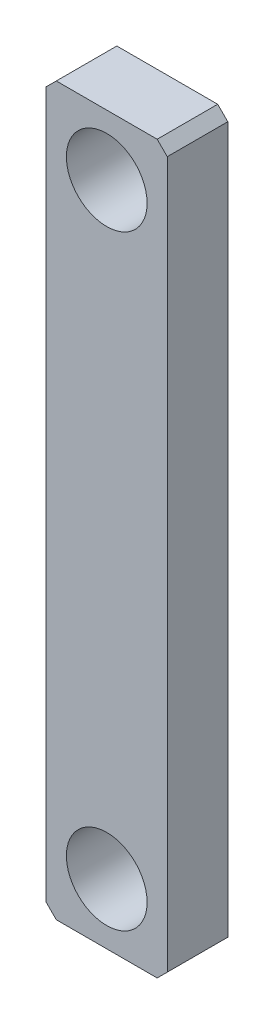
ISO-10303-21;
HEADER;
FILE_DESCRIPTION(('STEP AP214'),'2;1');
FILE_NAME('part.step','',(''),(''),'','','');
FILE_SCHEMA(('AUTOMOTIVE_DESIGN { 1 0 10303 214 1 1 1 1 }'));
ENDSEC;
DATA;
#1=APPLICATION_CONTEXT('core data for automotive mechanical design processes');
#2=APPLICATION_PROTOCOL_DEFINITION('international standard','automotive_design',2000,#1);
#3=PRODUCT_CONTEXT('',#1,'mechanical');
#4=PRODUCT('Part','Part','',(#3));
#5=PRODUCT_RELATED_PRODUCT_CATEGORY('part','',(#4));
#6=PRODUCT_DEFINITION_FORMATION('','',#4);
#7=PRODUCT_DEFINITION_CONTEXT('part definition',#1,'design');
#8=PRODUCT_DEFINITION('design','',#6,#7);
#9=PRODUCT_DEFINITION_SHAPE('','',#8);
#10=(LENGTH_UNIT() NAMED_UNIT(*) SI_UNIT(.MILLI.,.METRE.));
#11=(NAMED_UNIT(*) PLANE_ANGLE_UNIT() SI_UNIT($,.RADIAN.));
#12=(NAMED_UNIT(*) SI_UNIT($,.STERADIAN.) SOLID_ANGLE_UNIT());
#13=UNCERTAINTY_MEASURE_WITH_UNIT(LENGTH_MEASURE(1.E-05),#10,'distance_accuracy_value','');
#14=(GEOMETRIC_REPRESENTATION_CONTEXT(3) GLOBAL_UNCERTAINTY_ASSIGNED_CONTEXT((#13)) GLOBAL_UNIT_ASSIGNED_CONTEXT((#10,
#11,#12)) REPRESENTATION_CONTEXT('',''));
#15=CARTESIAN_POINT('',(0.,0.,0.));
#16=DIRECTION('',(0.,0.,1.));
#17=DIRECTION('',(1.,0.,0.));
#18=AXIS2_PLACEMENT_3D('',#15,#16,#17);
#19=CARTESIAN_POINT('',(0.,0.,6.));
#20=DIRECTION('',(1.,0.,0.));
#21=DIRECTION('',(0.,0.,-1.));
#22=AXIS2_PLACEMENT_3D('',#19,#20,#21);
#23=PLANE('',#22);
#24=DIRECTION('',(0.,-1.,0.));
#25=VECTOR('',#24,1.);
#26=CARTESIAN_POINT('',(0.,0.,0.));
#27=LINE('',#26,#25);
#28=CARTESIAN_POINT('',(0.,71.,0.));
#29=VERTEX_POINT('',#28);
#30=CARTESIAN_POINT('',(0.,1.00000000000001,0.));
#31=VERTEX_POINT('',#30);
#32=EDGE_CURVE('E137',#29,#31,#27,.T.);
#33=ORIENTED_EDGE('',*,*,#32,.T.);
#34=DIRECTION('',(0.,0.,1.));
#35=VECTOR('',#34,1.);
#36=CARTESIAN_POINT('',(0.,1.00000000000001,6.));
#37=LINE('',#36,#35);
#38=CARTESIAN_POINT('',(0.,1.00000000000001,6.));
#39=VERTEX_POINT('',#38);
#40=EDGE_CURVE('E115',#31,#39,#37,.T.);
#41=ORIENTED_EDGE('',*,*,#40,.T.);
#42=DIRECTION('',(0.,-1.,0.));
#43=VECTOR('',#42,1.);
#44=CARTESIAN_POINT('',(0.,0.,6.));
#45=LINE('',#44,#43);
#46=CARTESIAN_POINT('',(0.,71.,6.));
#47=VERTEX_POINT('',#46);
#48=EDGE_CURVE('E147',#47,#39,#45,.T.);
#49=ORIENTED_EDGE('',*,*,#48,.F.);
#50=DIRECTION('',(0.,0.,-1.));
#51=VECTOR('',#50,1.);
#52=CARTESIAN_POINT('',(0.,71.,6.));
#53=LINE('',#52,#51);
#54=EDGE_CURVE('E120',#47,#29,#53,.T.);
#55=ORIENTED_EDGE('',*,*,#54,.T.);
#56=EDGE_LOOP('',(#33,#41,#49,#55));
#57=FACE_BOUND('',#56,.T.);
#58=ADVANCED_FACE('F43',(#57),#23,.F.);
#59=CARTESIAN_POINT('',(0.,0.,6.));
#60=DIRECTION('',(0.,1.,0.));
#61=DIRECTION('',(0.,0.,1.));
#62=AXIS2_PLACEMENT_3D('',#59,#60,#61);
#63=PLANE('',#62);
#64=DIRECTION('',(1.,0.,0.));
#65=VECTOR('',#64,1.);
#66=CARTESIAN_POINT('',(0.,0.,6.));
#67=LINE('',#66,#65);
#68=CARTESIAN_POINT('',(1.,0.,6.));
#69=VERTEX_POINT('',#68);
#70=CARTESIAN_POINT('',(11.,0.,6.));
#71=VERTEX_POINT('',#70);
#72=EDGE_CURVE('E130',#69,#71,#67,.T.);
#73=ORIENTED_EDGE('',*,*,#72,.F.);
#74=DIRECTION('',(0.,0.,-1.));
#75=VECTOR('',#74,1.);
#76=CARTESIAN_POINT('',(1.,0.,6.));
#77=LINE('',#76,#75);
#78=CARTESIAN_POINT('',(1.,0.,0.));
#79=VERTEX_POINT('',#78);
#80=EDGE_CURVE('E114',#69,#79,#77,.T.);
#81=ORIENTED_EDGE('',*,*,#80,.T.);
#82=DIRECTION('',(1.,0.,0.));
#83=VECTOR('',#82,1.);
#84=CARTESIAN_POINT('',(0.,0.,0.));
#85=LINE('',#84,#83);
#86=CARTESIAN_POINT('',(11.,0.,0.));
#87=VERTEX_POINT('',#86);
#88=EDGE_CURVE('E127',#79,#87,#85,.T.);
#89=ORIENTED_EDGE('',*,*,#88,.T.);
#90=DIRECTION('',(0.,0.,1.));
#91=VECTOR('',#90,1.);
#92=CARTESIAN_POINT('',(11.,0.,6.));
#93=LINE('',#92,#91);
#94=EDGE_CURVE('E132',#87,#71,#93,.T.);
#95=ORIENTED_EDGE('',*,*,#94,.T.);
#96=EDGE_LOOP('',(#73,#81,#89,#95));
#97=FACE_BOUND('',#96,.T.);
#98=ADVANCED_FACE('F126',(#97),#63,.F.);
#99=CARTESIAN_POINT('',(12.,0.,6.));
#100=DIRECTION('',(-1.,0.,0.));
#101=DIRECTION('',(0.,-1.,0.));
#102=AXIS2_PLACEMENT_3D('',#99,#100,#101);
#103=PLANE('',#102);
#104=DIRECTION('',(0.,1.,0.));
#105=VECTOR('',#104,1.);
#106=CARTESIAN_POINT('',(12.,0.,6.));
#107=LINE('',#106,#105);
#108=CARTESIAN_POINT('',(12.,1.,6.));
#109=VERTEX_POINT('',#108);
#110=CARTESIAN_POINT('',(12.,71.,6.));
#111=VERTEX_POINT('',#110);
#112=EDGE_CURVE('E173',#109,#111,#107,.T.);
#113=ORIENTED_EDGE('',*,*,#112,.F.);
#114=DIRECTION('',(0.,0.,-1.));
#115=VECTOR('',#114,1.);
#116=CARTESIAN_POINT('',(12.,1.,6.));
#117=LINE('',#116,#115);
#118=CARTESIAN_POINT('',(12.,1.,0.));
#119=VERTEX_POINT('',#118);
#120=EDGE_CURVE('E166',#109,#119,#117,.T.);
#121=ORIENTED_EDGE('',*,*,#120,.T.);
#122=DIRECTION('',(0.,1.,0.));
#123=VECTOR('',#122,1.);
#124=CARTESIAN_POINT('',(12.,0.,0.));
#125=LINE('',#124,#123);
#126=CARTESIAN_POINT('',(12.,71.,0.));
#127=VERTEX_POINT('',#126);
#128=EDGE_CURVE('E136',#119,#127,#125,.T.);
#129=ORIENTED_EDGE('',*,*,#128,.T.);
#130=DIRECTION('',(0.,0.,1.));
#131=VECTOR('',#130,1.);
#132=CARTESIAN_POINT('',(12.,71.,6.));
#133=LINE('',#132,#131);
#134=EDGE_CURVE('E164',#127,#111,#133,.T.);
#135=ORIENTED_EDGE('',*,*,#134,.T.);
#136=EDGE_LOOP('',(#113,#121,#129,#135));
#137=FACE_BOUND('',#136,.T.);
#138=ADVANCED_FACE('F171',(#137),#103,.F.);
#139=CARTESIAN_POINT('',(0.,72.,6.));
#140=DIRECTION('',(0.,-1.,0.));
#141=DIRECTION('',(0.,0.,-1.));
#142=AXIS2_PLACEMENT_3D('',#139,#140,#141);
#143=PLANE('',#142);
#144=DIRECTION('',(-1.,0.,0.));
#145=VECTOR('',#144,1.);
#146=CARTESIAN_POINT('',(0.,72.,6.));
#147=LINE('',#146,#145);
#148=CARTESIAN_POINT('',(11.,72.,6.));
#149=VERTEX_POINT('',#148);
#150=CARTESIAN_POINT('',(0.999999999999994,72.,6.));
#151=VERTEX_POINT('',#150);
#152=EDGE_CURVE('E148',#149,#151,#147,.T.);
#153=ORIENTED_EDGE('',*,*,#152,.F.);
#154=DIRECTION('',(0.,0.,-1.));
#155=VECTOR('',#154,1.);
#156=CARTESIAN_POINT('',(11.,72.,6.));
#157=LINE('',#156,#155);
#158=CARTESIAN_POINT('',(11.,72.,0.));
#159=VERTEX_POINT('',#158);
#160=EDGE_CURVE('E11',#149,#159,#157,.T.);
#161=ORIENTED_EDGE('',*,*,#160,.T.);
#162=DIRECTION('',(-1.,0.,0.));
#163=VECTOR('',#162,1.);
#164=CARTESIAN_POINT('',(0.,72.,0.));
#165=LINE('',#164,#163);
#166=CARTESIAN_POINT('',(0.999999999999994,72.,0.));
#167=VERTEX_POINT('',#166);
#168=EDGE_CURVE('E140',#159,#167,#165,.T.);
#169=ORIENTED_EDGE('',*,*,#168,.T.);
#170=DIRECTION('',(0.,0.,1.));
#171=VECTOR('',#170,1.);
#172=CARTESIAN_POINT('',(0.999999999999994,72.,6.));
#173=LINE('',#172,#171);
#174=EDGE_CURVE('E52',#167,#151,#173,.T.);
#175=ORIENTED_EDGE('',*,*,#174,.T.);
#176=EDGE_LOOP('',(#153,#161,#169,#175));
#177=FACE_BOUND('',#176,.T.);
#178=ADVANCED_FACE('F180',(#177),#143,.F.);
#179=CARTESIAN_POINT('',(0.,0.,6.));
#180=DIRECTION('',(0.,0.,-1.));
#181=DIRECTION('',(-1.,0.,0.));
#182=AXIS2_PLACEMENT_3D('',#179,#180,#181);
#183=PLANE('',#182);
#184=CARTESIAN_POINT('',(6.,6.,6.));
#185=DIRECTION('',(0.,0.,1.));
#186=DIRECTION('',(1.,0.,0.));
#187=AXIS2_PLACEMENT_3D('',#184,#185,#186);
#188=CIRCLE('',#187,4.);
#189=CARTESIAN_POINT('',(10.,6.,6.));
#190=VERTEX_POINT('',#189);
#191=EDGE_CURVE('E193',#190,#190,#188,.T.);
#192=ORIENTED_EDGE('',*,*,#191,.F.);
#193=EDGE_LOOP('',(#192));
#194=FACE_BOUND('',#193,.T.);
#195=CARTESIAN_POINT('',(6.,66.,6.));
#196=DIRECTION('',(0.,0.,1.));
#197=DIRECTION('',(1.,0.,0.));
#198=AXIS2_PLACEMENT_3D('',#195,#196,#197);
#199=CIRCLE('',#198,4.00000000000001);
#200=CARTESIAN_POINT('',(10.,66.,6.));
#201=VERTEX_POINT('',#200);
#202=EDGE_CURVE('E187',#201,#201,#199,.T.);
#203=ORIENTED_EDGE('',*,*,#202,.F.);
#204=EDGE_LOOP('',(#203));
#205=FACE_BOUND('',#204,.T.);
#206=ORIENTED_EDGE('',*,*,#48,.T.);
#207=DIRECTION('',(-0.707106781186545,0.70710678118655,0.));
#208=VECTOR('',#207,1.);
#209=CARTESIAN_POINT('',(1.,0.,6.));
#210=LINE('',#209,#208);
#211=EDGE_CURVE('E162',#39,#69,#210,.F.);
#212=ORIENTED_EDGE('',*,*,#211,.T.);
#213=ORIENTED_EDGE('',*,*,#72,.T.);
#214=DIRECTION('',(-0.70710678118655,-0.707106781186545,0.));
#215=VECTOR('',#214,1.);
#216=CARTESIAN_POINT('',(12.,1.,6.));
#217=LINE('',#216,#215);
#218=EDGE_CURVE('E160',#71,#109,#217,.F.);
#219=ORIENTED_EDGE('',*,*,#218,.T.);
#220=ORIENTED_EDGE('',*,*,#112,.T.);
#221=DIRECTION('',(0.707106781186543,-0.707106781186552,0.));
#222=VECTOR('',#221,1.);
#223=CARTESIAN_POINT('',(11.,72.,6.));
#224=LINE('',#223,#222);
#225=EDGE_CURVE('E65',#111,#149,#224,.F.);
#226=ORIENTED_EDGE('',*,*,#225,.T.);
#227=ORIENTED_EDGE('',*,*,#152,.T.);
#228=DIRECTION('',(0.707106781186545,0.70710678118655,0.));
#229=VECTOR('',#228,1.);
#230=CARTESIAN_POINT('',(0.,71.,6.));
#231=LINE('',#230,#229);
#232=EDGE_CURVE('E157',#151,#47,#231,.F.);
#233=ORIENTED_EDGE('',*,*,#232,.T.);
#234=EDGE_LOOP('',(#206,#212,#213,#219,#220,#226,#227,#233));
#235=FACE_BOUND('',#234,.T.);
#236=ADVANCED_FACE('F208',(#194,#205,#235),#183,.F.);
#237=CARTESIAN_POINT('',(0.,0.,0.));
#238=DIRECTION('',(0.,0.,-1.));
#239=DIRECTION('',(-1.,0.,0.));
#240=AXIS2_PLACEMENT_3D('',#237,#238,#239);
#241=PLANE('',#240);
#242=CARTESIAN_POINT('',(6.,6.,0.));
#243=DIRECTION('',(0.,0.,1.));
#244=DIRECTION('',(1.,0.,0.));
#245=AXIS2_PLACEMENT_3D('',#242,#243,#244);
#246=CIRCLE('',#245,4.);
#247=CARTESIAN_POINT('',(10.,6.,0.));
#248=VERTEX_POINT('',#247);
#249=EDGE_CURVE('E190',#248,#248,#246,.T.);
#250=ORIENTED_EDGE('',*,*,#249,.T.);
#251=EDGE_LOOP('',(#250));
#252=FACE_BOUND('',#251,.T.);
#253=CARTESIAN_POINT('',(6.,66.,0.));
#254=DIRECTION('',(0.,0.,1.));
#255=DIRECTION('',(1.,0.,0.));
#256=AXIS2_PLACEMENT_3D('',#253,#254,#255);
#257=CIRCLE('',#256,4.00000000000001);
#258=CARTESIAN_POINT('',(10.,66.,0.));
#259=VERTEX_POINT('',#258);
#260=EDGE_CURVE('E142',#259,#259,#257,.T.);
#261=ORIENTED_EDGE('',*,*,#260,.T.);
#262=EDGE_LOOP('',(#261));
#263=FACE_BOUND('',#262,.T.);
#264=ORIENTED_EDGE('',*,*,#88,.F.);
#265=DIRECTION('',(0.707106781186545,-0.70710678118655,0.));
#266=VECTOR('',#265,1.);
#267=CARTESIAN_POINT('',(0.500000000000004,0.5,0.));
#268=LINE('',#267,#266);
#269=EDGE_CURVE('E110',#79,#31,#268,.F.);
#270=ORIENTED_EDGE('',*,*,#269,.T.);
#271=ORIENTED_EDGE('',*,*,#32,.F.);
#272=DIRECTION('',(-0.707106781186545,-0.70710678118655,0.));
#273=VECTOR('',#272,1.);
#274=CARTESIAN_POINT('',(-35.5,35.4999999999997,0.));
#275=LINE('',#274,#273);
#276=EDGE_CURVE('E131',#29,#167,#275,.F.);
#277=ORIENTED_EDGE('',*,*,#276,.T.);
#278=ORIENTED_EDGE('',*,*,#168,.F.);
#279=DIRECTION('',(-0.707106781186543,0.707106781186552,0.));
#280=VECTOR('',#279,1.);
#281=CARTESIAN_POINT('',(41.5000000000001,41.4999999999995,0.));
#282=LINE('',#281,#280);
#283=EDGE_CURVE('E151',#159,#127,#282,.F.);
#284=ORIENTED_EDGE('',*,*,#283,.T.);
#285=ORIENTED_EDGE('',*,*,#128,.F.);
#286=DIRECTION('',(0.70710678118655,0.707106781186545,0.));
#287=VECTOR('',#286,1.);
#288=CARTESIAN_POINT('',(5.49999999999996,-5.5,0.));
#289=LINE('',#288,#287);
#290=EDGE_CURVE('E121',#119,#87,#289,.F.);
#291=ORIENTED_EDGE('',*,*,#290,.T.);
#292=EDGE_LOOP('',(#264,#270,#271,#277,#278,#284,#285,#291));
#293=FACE_BOUND('',#292,.T.);
#294=ADVANCED_FACE('F134',(#252,#263,#293),#241,.T.);
#295=CARTESIAN_POINT('',(6.,66.,0.));
#296=DIRECTION('',(0.,0.,1.));
#297=DIRECTION('',(1.,0.,0.));
#298=AXIS2_PLACEMENT_3D('',#295,#296,#297);
#299=CYLINDRICAL_SURFACE('',#298,4.00000000000001);
#300=ORIENTED_EDGE('',*,*,#260,.F.);
#301=EDGE_LOOP('',(#300));
#302=FACE_BOUND('',#301,.T.);
#303=ORIENTED_EDGE('',*,*,#202,.T.);
#304=EDGE_LOOP('',(#303));
#305=FACE_BOUND('',#304,.T.);
#306=ADVANCED_FACE('F204',(#302,#305),#299,.F.);
#307=CARTESIAN_POINT('',(6.,6.,0.));
#308=DIRECTION('',(0.,0.,1.));
#309=DIRECTION('',(1.,0.,0.));
#310=AXIS2_PLACEMENT_3D('',#307,#308,#309);
#311=CYLINDRICAL_SURFACE('',#310,4.);
#312=ORIENTED_EDGE('',*,*,#249,.F.);
#313=EDGE_LOOP('',(#312));
#314=FACE_BOUND('',#313,.T.);
#315=ORIENTED_EDGE('',*,*,#191,.T.);
#316=EDGE_LOOP('',(#315));
#317=FACE_BOUND('',#316,.T.);
#318=ADVANCED_FACE('F201',(#314,#317),#311,.F.);
#319=CARTESIAN_POINT('',(1.,0.,6.));
#320=DIRECTION('',(0.70710678118655,0.707106781186545,0.));
#321=DIRECTION('',(0.,0.,-1.));
#322=AXIS2_PLACEMENT_3D('',#319,#320,#321);
#323=PLANE('',#322);
#324=ORIENTED_EDGE('',*,*,#211,.F.);
#325=ORIENTED_EDGE('',*,*,#40,.F.);
#326=ORIENTED_EDGE('',*,*,#269,.F.);
#327=ORIENTED_EDGE('',*,*,#80,.F.);
#328=EDGE_LOOP('',(#324,#325,#326,#327));
#329=FACE_BOUND('',#328,.T.);
#330=ADVANCED_FACE('F113',(#329),#323,.F.);
#331=CARTESIAN_POINT('',(12.,1.,6.));
#332=DIRECTION('',(-0.707106781186545,0.70710678118655,0.));
#333=DIRECTION('',(0.,0.,-1.));
#334=AXIS2_PLACEMENT_3D('',#331,#332,#333);
#335=PLANE('',#334);
#336=ORIENTED_EDGE('',*,*,#218,.F.);
#337=ORIENTED_EDGE('',*,*,#94,.F.);
#338=ORIENTED_EDGE('',*,*,#290,.F.);
#339=ORIENTED_EDGE('',*,*,#120,.F.);
#340=EDGE_LOOP('',(#336,#337,#338,#339));
#341=FACE_BOUND('',#340,.T.);
#342=ADVANCED_FACE('F221',(#341),#335,.F.);
#343=CARTESIAN_POINT('',(11.,72.,6.));
#344=DIRECTION('',(-0.707106781186552,-0.707106781186542,0.));
#345=DIRECTION('',(0.,0.,-1.));
#346=AXIS2_PLACEMENT_3D('',#343,#344,#345);
#347=PLANE('',#346);
#348=ORIENTED_EDGE('',*,*,#225,.F.);
#349=ORIENTED_EDGE('',*,*,#134,.F.);
#350=ORIENTED_EDGE('',*,*,#283,.F.);
#351=ORIENTED_EDGE('',*,*,#160,.F.);
#352=EDGE_LOOP('',(#348,#349,#350,#351));
#353=FACE_BOUND('',#352,.T.);
#354=ADVANCED_FACE('F179',(#353),#347,.F.);
#355=CARTESIAN_POINT('',(0.,71.,6.));
#356=DIRECTION('',(0.70710678118655,-0.707106781186545,0.));
#357=DIRECTION('',(0.,0.,-1.));
#358=AXIS2_PLACEMENT_3D('',#355,#356,#357);
#359=PLANE('',#358);
#360=ORIENTED_EDGE('',*,*,#232,.F.);
#361=ORIENTED_EDGE('',*,*,#174,.F.);
#362=ORIENTED_EDGE('',*,*,#276,.F.);
#363=ORIENTED_EDGE('',*,*,#54,.F.);
#364=EDGE_LOOP('',(#360,#361,#362,#363));
#365=FACE_BOUND('',#364,.T.);
#366=ADVANCED_FACE('F46',(#365),#359,.F.);
#367=CLOSED_SHELL('',(#58,#98,#138,#178,#236,#294,#306,#318,#330,#342,#354,#366));
#368=MANIFOLD_SOLID_BREP('B2',#367);
#369=ADVANCED_BREP_SHAPE_REPRESENTATION('',(#18,#368),#14);
#370=SHAPE_DEFINITION_REPRESENTATION(#9,#369);
ENDSEC;
END-ISO-10303-21;
